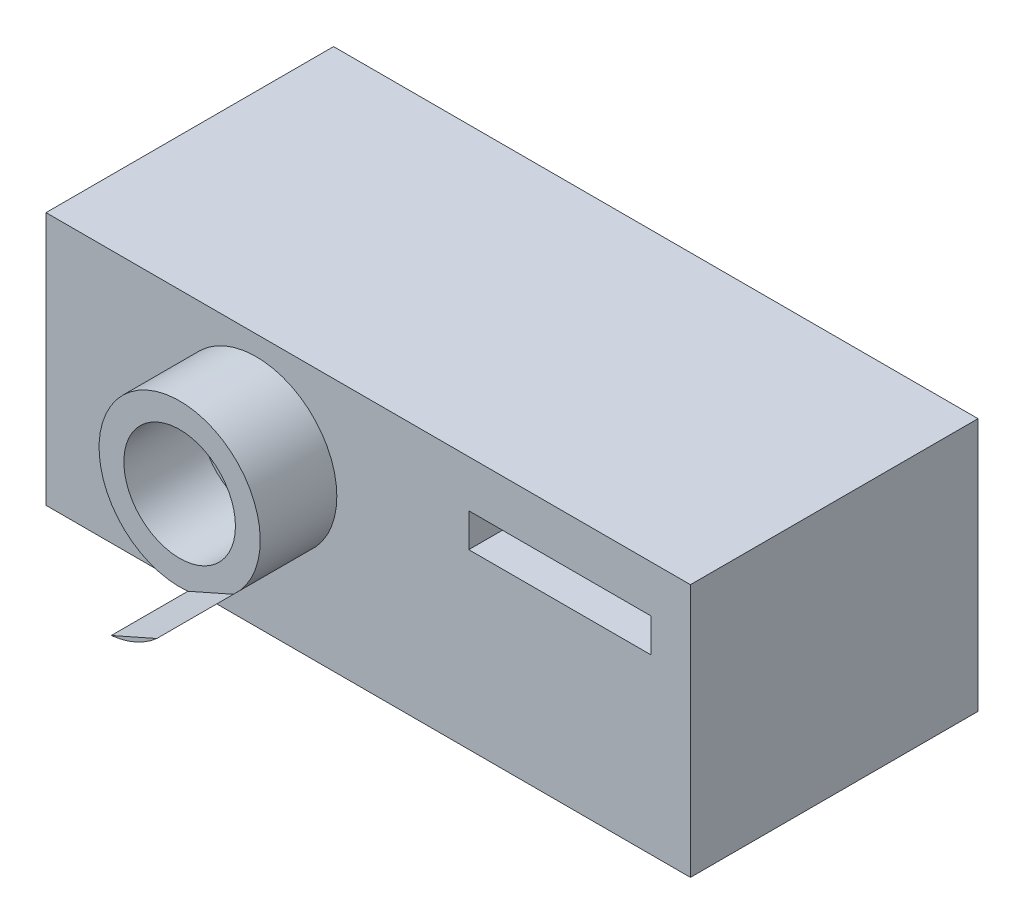
ISO-10303-21;
HEADER;
FILE_DESCRIPTION(('STEP AP214'),'2;1');
FILE_NAME('part.step','',(''),(''),'','','');
FILE_SCHEMA(('AUTOMOTIVE_DESIGN { 1 0 10303 214 1 1 1 1 }'));
ENDSEC;
DATA;
#1=APPLICATION_CONTEXT('core data for automotive mechanical design processes');
#2=APPLICATION_PROTOCOL_DEFINITION('international standard','automotive_design',2000,#1);
#3=PRODUCT_CONTEXT('',#1,'mechanical');
#4=PRODUCT('Part','Part','',(#3));
#5=PRODUCT_RELATED_PRODUCT_CATEGORY('part','',(#4));
#6=PRODUCT_DEFINITION_FORMATION('','',#4);
#7=PRODUCT_DEFINITION_CONTEXT('part definition',#1,'design');
#8=PRODUCT_DEFINITION('design','',#6,#7);
#9=PRODUCT_DEFINITION_SHAPE('','',#8);
#10=(LENGTH_UNIT() NAMED_UNIT(*) SI_UNIT(.MILLI.,.METRE.));
#11=(NAMED_UNIT(*) PLANE_ANGLE_UNIT() SI_UNIT($,.RADIAN.));
#12=(NAMED_UNIT(*) SI_UNIT($,.STERADIAN.) SOLID_ANGLE_UNIT());
#13=UNCERTAINTY_MEASURE_WITH_UNIT(LENGTH_MEASURE(1.E-05),#10,'distance_accuracy_value','');
#14=(GEOMETRIC_REPRESENTATION_CONTEXT(3) GLOBAL_UNCERTAINTY_ASSIGNED_CONTEXT((#13)) GLOBAL_UNIT_ASSIGNED_CONTEXT((#10,
#11,#12)) REPRESENTATION_CONTEXT('',''));
#15=CARTESIAN_POINT('',(0.,0.,0.));
#16=DIRECTION('',(0.,0.,1.));
#17=DIRECTION('',(1.,0.,0.));
#18=AXIS2_PLACEMENT_3D('',#15,#16,#17);
#19=CARTESIAN_POINT('',(-43.2566473819894,0.601942054077203,72.6690788812328));
#20=DIRECTION('',(0.,0.,1.));
#21=DIRECTION('',(1.,0.,0.));
#22=AXIS2_PLACEMENT_3D('',#19,#20,#21);
#23=PLANE('',#22);
#24=CARTESIAN_POINT('',(-43.2566473819894,0.601942054077203,72.6690788812328));
#25=DIRECTION('',(0.,0.,1.));
#26=DIRECTION('',(1.,0.,0.));
#27=AXIS2_PLACEMENT_3D('',#24,#25,#26);
#28=CIRCLE('',#27,13.4695419870651);
#29=CARTESIAN_POINT('',(-41.8807614743845,-12.7971437099055,72.6690788812328));
#30=VERTEX_POINT('',#29);
#31=CARTESIAN_POINT('',(-34.2722904315261,-9.4334897516784,72.6690788812328));
#32=VERTEX_POINT('',#31);
#33=EDGE_CURVE('E177',#30,#32,#28,.T.);
#34=ORIENTED_EDGE('',*,*,#33,.T.);
#35=DIRECTION('',(-0.914607866752376,-0.404341996427118,0.));
#36=VECTOR('',#35,1.);
#37=CARTESIAN_POINT('',(-38.0765259529553,-11.115316730792,72.6690788812328));
#38=LINE('',#37,#36);
#39=EDGE_CURVE('E173',#32,#30,#38,.T.);
#40=ORIENTED_EDGE('',*,*,#39,.T.);
#41=EDGE_LOOP('',(#34,#40));
#42=FACE_BOUND('',#41,.T.);
#43=ADVANCED_FACE('F55',(#42),#23,.T.);
#44=CARTESIAN_POINT('',(-43.2566473819894,0.601942054077203,72.6690788812328));
#45=DIRECTION('',(0.,0.,-1.));
#46=DIRECTION('',(-1.,0.,0.));
#47=AXIS2_PLACEMENT_3D('',#44,#45,#46);
#48=CYLINDRICAL_SURFACE('',#47,13.4695419870651);
#49=CARTESIAN_POINT('',(-43.2566473819894,0.601942054077203,47.0645021550188));
#50=DIRECTION('',(0.,0.,1.));
#51=DIRECTION('',(1.,0.,0.));
#52=AXIS2_PLACEMENT_3D('',#49,#50,#51);
#53=CIRCLE('',#52,13.4695419870651);
#54=CARTESIAN_POINT('',(-29.7871053949243,0.601942054077203,47.0645021550188));
#55=VERTEX_POINT('',#54);
#56=EDGE_CURVE('E176',#55,#55,#53,.T.);
#57=ORIENTED_EDGE('',*,*,#56,.T.);
#58=EDGE_LOOP('',(#57));
#59=FACE_BOUND('',#58,.T.);
#60=DIRECTION('',(0.,0.,-1.));
#61=VECTOR('',#60,1.);
#62=CARTESIAN_POINT('',(-34.2722904315261,-9.4334897516784,72.6690788812328));
#63=LINE('',#62,#61);
#64=CARTESIAN_POINT('',(-34.2722904315261,-9.4334897516784,59.8667905181258));
#65=VERTEX_POINT('',#64);
#66=EDGE_CURVE('E13',#32,#65,#63,.T.);
#67=ORIENTED_EDGE('',*,*,#66,.F.);
#68=ORIENTED_EDGE('',*,*,#33,.F.);
#69=DIRECTION('',(0.,0.,-1.));
#70=VECTOR('',#69,1.);
#71=CARTESIAN_POINT('',(-41.8807614743845,-12.7971437099055,72.6690788812328));
#72=LINE('',#71,#70);
#73=CARTESIAN_POINT('',(-41.8807614743845,-12.7971437099055,59.8667905181258));
#74=VERTEX_POINT('',#73);
#75=EDGE_CURVE('E63',#74,#30,#72,.F.);
#76=ORIENTED_EDGE('',*,*,#75,.F.);
#77=CARTESIAN_POINT('',(-43.2566473819894,0.601942054077203,59.8667905181258));
#78=DIRECTION('',(0.,0.,1.));
#79=DIRECTION('',(1.,0.,0.));
#80=AXIS2_PLACEMENT_3D('',#77,#78,#79);
#81=CIRCLE('',#80,13.4695419870651);
#82=EDGE_CURVE('E171',#65,#74,#81,.T.);
#83=ORIENTED_EDGE('',*,*,#82,.F.);
#84=EDGE_LOOP('',(#67,#68,#76,#83));
#85=FACE_BOUND('',#84,.T.);
#86=ADVANCED_FACE('F225',(#59,#85),#48,.T.);
#87=CARTESIAN_POINT('',(0.,0.,47.0645021550188));
#88=DIRECTION('',(0.,0.,1.));
#89=DIRECTION('',(1.,0.,0.));
#90=AXIS2_PLACEMENT_3D('',#87,#88,#89);
#91=PLANE('',#90);
#92=DIRECTION('',(0.,-1.,0.));
#93=VECTOR('',#92,1.);
#94=CARTESIAN_POINT('',(-7.73257116674131,3.89403962223867,47.0645021550188));
#95=LINE('',#94,#93);
#96=CARTESIAN_POINT('',(-7.73257116674131,9.5273575375785,47.0645021550188));
#97=VERTEX_POINT('',#96);
#98=CARTESIAN_POINT('',(-7.73257116674131,3.89403962223867,47.0645021550188));
#99=VERTEX_POINT('',#98);
#100=EDGE_CURVE('E70',#97,#99,#95,.T.);
#101=ORIENTED_EDGE('',*,*,#100,.F.);
#102=DIRECTION('',(-1.,0.,0.));
#103=VECTOR('',#102,1.);
#104=CARTESIAN_POINT('',(-7.73257116674131,9.5273575375785,47.0645021550188));
#105=LINE('',#104,#103);
#106=CARTESIAN_POINT('',(22.6942266019137,9.5273575375785,47.0645021550188));
#107=VERTEX_POINT('',#106);
#108=EDGE_CURVE('E151',#107,#97,#105,.T.);
#109=ORIENTED_EDGE('',*,*,#108,.F.);
#110=DIRECTION('',(0.,1.,0.));
#111=VECTOR('',#110,1.);
#112=CARTESIAN_POINT('',(22.6942266019137,3.89403962223867,47.0645021550188));
#113=LINE('',#112,#111);
#114=CARTESIAN_POINT('',(22.6942266019137,3.89403962223867,47.0645021550188));
#115=VERTEX_POINT('',#114);
#116=EDGE_CURVE('E154',#115,#107,#113,.T.);
#117=ORIENTED_EDGE('',*,*,#116,.F.);
#118=DIRECTION('',(1.,0.,0.));
#119=VECTOR('',#118,1.);
#120=CARTESIAN_POINT('',(-7.73257116674131,3.89403962223867,47.0645021550188));
#121=LINE('',#120,#119);
#122=EDGE_CURVE('E160',#99,#115,#121,.T.);
#123=ORIENTED_EDGE('',*,*,#122,.F.);
#124=EDGE_LOOP('',(#101,#109,#117,#123));
#125=FACE_BOUND('',#124,.T.);
#126=DIRECTION('',(0.,-1.,0.));
#127=VECTOR('',#126,1.);
#128=CARTESIAN_POINT('',(-78.3975170386473,17.3523688663283,47.0645021550188));
#129=LINE('',#128,#127);
#130=CARTESIAN_POINT('',(-78.3975170386473,17.3523688663283,47.0645021550188));
#131=VERTEX_POINT('',#130);
#132=CARTESIAN_POINT('',(-78.3975170386473,-25.0239424703892,47.0645021550188));
#133=VERTEX_POINT('',#132);
#134=EDGE_CURVE('E180',#131,#133,#129,.T.);
#135=ORIENTED_EDGE('',*,*,#134,.T.);
#136=DIRECTION('',(1.,0.,0.));
#137=VECTOR('',#136,1.);
#138=CARTESIAN_POINT('',(-78.3975170386473,-25.0239424703892,47.0645021550188));
#139=LINE('',#138,#137);
#140=CARTESIAN_POINT('',(29.3156280043262,-25.0239424703892,47.0645021550188));
#141=VERTEX_POINT('',#140);
#142=EDGE_CURVE('E185',#133,#141,#139,.T.);
#143=ORIENTED_EDGE('',*,*,#142,.T.);
#144=DIRECTION('',(0.,1.,0.));
#145=VECTOR('',#144,1.);
#146=CARTESIAN_POINT('',(29.3156280043262,17.3523688663283,47.0645021550188));
#147=LINE('',#146,#145);
#148=CARTESIAN_POINT('',(29.3156280043262,17.3523688663283,47.0645021550188));
#149=VERTEX_POINT('',#148);
#150=EDGE_CURVE('E188',#141,#149,#147,.T.);
#151=ORIENTED_EDGE('',*,*,#150,.T.);
#152=DIRECTION('',(-1.,0.,0.));
#153=VECTOR('',#152,1.);
#154=CARTESIAN_POINT('',(-78.3975170386473,17.3523688663283,47.0645021550188));
#155=LINE('',#154,#153);
#156=EDGE_CURVE('E191',#149,#131,#155,.T.);
#157=ORIENTED_EDGE('',*,*,#156,.T.);
#158=EDGE_LOOP('',(#135,#143,#151,#157));
#159=FACE_BOUND('',#158,.T.);
#160=ORIENTED_EDGE('',*,*,#56,.F.);
#161=EDGE_LOOP('',(#160));
#162=FACE_BOUND('',#161,.T.);
#163=ADVANCED_FACE('F239',(#125,#159,#162),#91,.T.);
#164=CARTESIAN_POINT('',(-78.3975170386473,17.3523688663283,-1.));
#165=DIRECTION('',(-1.,0.,0.));
#166=DIRECTION('',(0.,0.,1.));
#167=AXIS2_PLACEMENT_3D('',#164,#165,#166);
#168=PLANE('',#167);
#169=DIRECTION('',(0.,0.,1.));
#170=VECTOR('',#169,1.);
#171=CARTESIAN_POINT('',(-78.3975170386473,-25.0239424703892,-1.));
#172=LINE('',#171,#170);
#173=CARTESIAN_POINT('',(-78.3975170386473,-25.0239424703892,-1.));
#174=VERTEX_POINT('',#173);
#175=EDGE_CURVE('E206',#174,#133,#172,.T.);
#176=ORIENTED_EDGE('',*,*,#175,.T.);
#177=ORIENTED_EDGE('',*,*,#134,.F.);
#178=DIRECTION('',(0.,0.,1.));
#179=VECTOR('',#178,1.);
#180=CARTESIAN_POINT('',(-78.3975170386473,17.3523688663283,-1.));
#181=LINE('',#180,#179);
#182=CARTESIAN_POINT('',(-78.3975170386473,17.3523688663283,-1.));
#183=VERTEX_POINT('',#182);
#184=EDGE_CURVE('E207',#183,#131,#181,.T.);
#185=ORIENTED_EDGE('',*,*,#184,.F.);
#186=DIRECTION('',(0.,-1.,0.));
#187=VECTOR('',#186,1.);
#188=CARTESIAN_POINT('',(-78.3975170386473,17.3523688663283,-1.));
#189=LINE('',#188,#187);
#190=EDGE_CURVE('E194',#183,#174,#189,.T.);
#191=ORIENTED_EDGE('',*,*,#190,.T.);
#192=EDGE_LOOP('',(#176,#177,#185,#191));
#193=FACE_BOUND('',#192,.T.);
#194=ADVANCED_FACE('F57',(#193),#168,.T.);
#195=CARTESIAN_POINT('',(-78.3975170386473,17.3523688663283,-1.));
#196=DIRECTION('',(0.,1.,0.));
#197=DIRECTION('',(0.,0.,1.));
#198=AXIS2_PLACEMENT_3D('',#195,#196,#197);
#199=PLANE('',#198);
#200=ORIENTED_EDGE('',*,*,#184,.T.);
#201=ORIENTED_EDGE('',*,*,#156,.F.);
#202=DIRECTION('',(0.,0.,1.));
#203=VECTOR('',#202,1.);
#204=CARTESIAN_POINT('',(29.3156280043262,17.3523688663283,-1.));
#205=LINE('',#204,#203);
#206=CARTESIAN_POINT('',(29.3156280043262,17.3523688663283,-1.));
#207=VERTEX_POINT('',#206);
#208=EDGE_CURVE('E210',#207,#149,#205,.T.);
#209=ORIENTED_EDGE('',*,*,#208,.F.);
#210=DIRECTION('',(-1.,0.,0.));
#211=VECTOR('',#210,1.);
#212=CARTESIAN_POINT('',(-78.3975170386473,17.3523688663283,-1.));
#213=LINE('',#212,#211);
#214=EDGE_CURVE('E203',#207,#183,#213,.T.);
#215=ORIENTED_EDGE('',*,*,#214,.T.);
#216=EDGE_LOOP('',(#200,#201,#209,#215));
#217=FACE_BOUND('',#216,.T.);
#218=ADVANCED_FACE('F256',(#217),#199,.T.);
#219=CARTESIAN_POINT('',(29.3156280043262,17.3523688663283,-1.));
#220=DIRECTION('',(1.,0.,0.));
#221=DIRECTION('',(0.,0.,-1.));
#222=AXIS2_PLACEMENT_3D('',#219,#220,#221);
#223=PLANE('',#222);
#224=ORIENTED_EDGE('',*,*,#208,.T.);
#225=ORIENTED_EDGE('',*,*,#150,.F.);
#226=DIRECTION('',(0.,0.,1.));
#227=VECTOR('',#226,1.);
#228=CARTESIAN_POINT('',(29.3156280043262,-25.0239424703892,-1.));
#229=LINE('',#228,#227);
#230=CARTESIAN_POINT('',(29.3156280043262,-25.0239424703892,-1.));
#231=VERTEX_POINT('',#230);
#232=EDGE_CURVE('E212',#231,#141,#229,.T.);
#233=ORIENTED_EDGE('',*,*,#232,.F.);
#234=DIRECTION('',(0.,1.,0.));
#235=VECTOR('',#234,1.);
#236=CARTESIAN_POINT('',(29.3156280043262,17.3523688663283,-1.));
#237=LINE('',#236,#235);
#238=EDGE_CURVE('E200',#231,#207,#237,.T.);
#239=ORIENTED_EDGE('',*,*,#238,.T.);
#240=EDGE_LOOP('',(#224,#225,#233,#239));
#241=FACE_BOUND('',#240,.T.);
#242=ADVANCED_FACE('F259',(#241),#223,.T.);
#243=CARTESIAN_POINT('',(-78.3975170386473,-25.0239424703892,-1.));
#244=DIRECTION('',(0.,-1.,0.));
#245=DIRECTION('',(0.,0.,-1.));
#246=AXIS2_PLACEMENT_3D('',#243,#244,#245);
#247=PLANE('',#246);
#248=ORIENTED_EDGE('',*,*,#232,.T.);
#249=ORIENTED_EDGE('',*,*,#142,.F.);
#250=ORIENTED_EDGE('',*,*,#175,.F.);
#251=DIRECTION('',(1.,0.,0.));
#252=VECTOR('',#251,1.);
#253=CARTESIAN_POINT('',(-78.3975170386473,-25.0239424703892,-1.));
#254=LINE('',#253,#252);
#255=EDGE_CURVE('E197',#174,#231,#254,.T.);
#256=ORIENTED_EDGE('',*,*,#255,.T.);
#257=EDGE_LOOP('',(#248,#249,#250,#256));
#258=FACE_BOUND('',#257,.T.);
#259=ADVANCED_FACE('F254',(#258),#247,.T.);
#260=CARTESIAN_POINT('',(0.,0.,-1.));
#261=DIRECTION('',(0.,0.,1.));
#262=DIRECTION('',(1.,0.,0.));
#263=AXIS2_PLACEMENT_3D('',#260,#261,#262);
#264=PLANE('',#263);
#265=ORIENTED_EDGE('',*,*,#190,.F.);
#266=ORIENTED_EDGE('',*,*,#214,.F.);
#267=ORIENTED_EDGE('',*,*,#238,.F.);
#268=ORIENTED_EDGE('',*,*,#255,.F.);
#269=EDGE_LOOP('',(#265,#266,#267,#268));
#270=FACE_BOUND('',#269,.T.);
#271=ADVANCED_FACE('F240',(#270),#264,.F.);
#272=CARTESIAN_POINT('',(-15.3383675423375,-1.06292958101637,59.8667905181258));
#273=DIRECTION('',(-0.404341996427118,0.914607866752376,0.));
#274=DIRECTION('',(-0.914607866752376,-0.404341996427118,0.));
#275=AXIS2_PLACEMENT_3D('',#272,#273,#274);
#276=PLANE('',#275);
#277=ORIENTED_EDGE('',*,*,#66,.T.);
#278=DIRECTION('',(-0.914607866752376,-0.404341996427118,0.));
#279=VECTOR('',#278,1.);
#280=CARTESIAN_POINT('',(-15.3383675423375,-1.06292958101637,59.8667905181258));
#281=LINE('',#280,#279);
#282=EDGE_CURVE('E77',#65,#74,#281,.T.);
#283=ORIENTED_EDGE('',*,*,#282,.T.);
#284=ORIENTED_EDGE('',*,*,#75,.T.);
#285=ORIENTED_EDGE('',*,*,#39,.F.);
#286=EDGE_LOOP('',(#277,#283,#284,#285));
#287=FACE_BOUND('',#286,.T.);
#288=ADVANCED_FACE('F219',(#287),#276,.T.);
#289=CARTESIAN_POINT('',(-24.5409445171605,-6.493207909042,59.8667905181258));
#290=DIRECTION('',(0.,0.,1.));
#291=DIRECTION('',(1.,0.,0.));
#292=AXIS2_PLACEMENT_3D('',#289,#290,#291);
#293=PLANE('',#292);
#294=CARTESIAN_POINT('',(-43.2566473819894,0.601942054077203,59.8667905181258));
#295=DIRECTION('',(0.,0.,1.));
#296=DIRECTION('',(1.,0.,0.));
#297=AXIS2_PLACEMENT_3D('',#294,#295,#296);
#298=CIRCLE('',#297,9.32585795243942);
#299=CARTESIAN_POINT('',(-33.93078942955,0.601942054077203,59.8667905181258));
#300=VERTEX_POINT('',#299);
#301=EDGE_CURVE('E170',#300,#300,#298,.T.);
#302=ORIENTED_EDGE('',*,*,#301,.F.);
#303=EDGE_LOOP('',(#302));
#304=FACE_BOUND('',#303,.T.);
#305=ORIENTED_EDGE('',*,*,#82,.T.);
#306=ORIENTED_EDGE('',*,*,#282,.F.);
#307=EDGE_LOOP('',(#305,#306));
#308=FACE_BOUND('',#307,.T.);
#309=ADVANCED_FACE('F227',(#304,#308),#293,.T.);
#310=CARTESIAN_POINT('',(-43.2566473819894,0.601942054077203,47.0645021550188));
#311=DIRECTION('',(0.,0.,1.));
#312=DIRECTION('',(1.,0.,0.));
#313=AXIS2_PLACEMENT_3D('',#310,#311,#312);
#314=CIRCLE('',#313,9.32585795243942);
#315=CARTESIAN_POINT('',(-33.93078942955,0.601942054077203,47.0645021550188));
#316=VERTEX_POINT('',#315);
#317=EDGE_CURVE('E209',#316,#316,#314,.F.);
#318=ORIENTED_EDGE('',*,*,#317,.F.);
#319=EDGE_LOOP('',(#318));
#320=FACE_BOUND('',#319,.T.);
#321=ADVANCED_FACE('F229',(#320),#91,.T.);
#322=CARTESIAN_POINT('',(-43.2566473819894,0.601942054077203,72.6690788812328));
#323=DIRECTION('',(0.,0.,-1.));
#324=DIRECTION('',(-1.,0.,0.));
#325=AXIS2_PLACEMENT_3D('',#322,#323,#324);
#326=CYLINDRICAL_SURFACE('',#325,9.32585795243942);
#327=ORIENTED_EDGE('',*,*,#317,.T.);
#328=EDGE_LOOP('',(#327));
#329=FACE_BOUND('',#328,.T.);
#330=ORIENTED_EDGE('',*,*,#301,.T.);
#331=EDGE_LOOP('',(#330));
#332=FACE_BOUND('',#331,.T.);
#333=ADVANCED_FACE('F236',(#329,#332),#326,.F.);
#334=CARTESIAN_POINT('',(-7.73257116674131,3.89403962223867,27.4599254288047));
#335=DIRECTION('',(-1.,0.,0.));
#336=DIRECTION('',(0.,0.,1.));
#337=AXIS2_PLACEMENT_3D('',#334,#335,#336);
#338=PLANE('',#337);
#339=ORIENTED_EDGE('',*,*,#100,.T.);
#340=DIRECTION('',(0.,0.,1.));
#341=VECTOR('',#340,1.);
#342=CARTESIAN_POINT('',(-7.73257116674131,3.89403962223867,27.4599254288047));
#343=LINE('',#342,#341);
#344=CARTESIAN_POINT('',(-7.73257116674131,3.89403962223867,27.4599254288047));
#345=VERTEX_POINT('',#344);
#346=EDGE_CURVE('E129',#345,#99,#343,.T.);
#347=ORIENTED_EDGE('',*,*,#346,.F.);
#348=DIRECTION('',(0.,-1.,0.));
#349=VECTOR('',#348,1.);
#350=CARTESIAN_POINT('',(-7.73257116674131,3.89403962223867,27.4599254288047));
#351=LINE('',#350,#349);
#352=CARTESIAN_POINT('',(-7.73257116674131,9.5273575375785,27.4599254288047));
#353=VERTEX_POINT('',#352);
#354=EDGE_CURVE('E133',#353,#345,#351,.T.);
#355=ORIENTED_EDGE('',*,*,#354,.F.);
#356=DIRECTION('',(0.,0.,1.));
#357=VECTOR('',#356,1.);
#358=CARTESIAN_POINT('',(-7.73257116674131,9.5273575375785,27.4599254288047));
#359=LINE('',#358,#357);
#360=EDGE_CURVE('E164',#353,#97,#359,.T.);
#361=ORIENTED_EDGE('',*,*,#360,.T.);
#362=EDGE_LOOP('',(#339,#347,#355,#361));
#363=FACE_BOUND('',#362,.T.);
#364=ADVANCED_FACE('F131',(#363),#338,.F.);
#365=CARTESIAN_POINT('',(-7.73257116674131,9.5273575375785,27.4599254288047));
#366=DIRECTION('',(0.,1.,0.));
#367=DIRECTION('',(0.,0.,1.));
#368=AXIS2_PLACEMENT_3D('',#365,#366,#367);
#369=PLANE('',#368);
#370=ORIENTED_EDGE('',*,*,#108,.T.);
#371=ORIENTED_EDGE('',*,*,#360,.F.);
#372=DIRECTION('',(-1.,0.,0.));
#373=VECTOR('',#372,1.);
#374=CARTESIAN_POINT('',(-7.73257116674131,9.5273575375785,27.4599254288047));
#375=LINE('',#374,#373);
#376=CARTESIAN_POINT('',(22.6942266019137,9.5273575375785,27.4599254288047));
#377=VERTEX_POINT('',#376);
#378=EDGE_CURVE('E139',#377,#353,#375,.T.);
#379=ORIENTED_EDGE('',*,*,#378,.F.);
#380=DIRECTION('',(0.,0.,1.));
#381=VECTOR('',#380,1.);
#382=CARTESIAN_POINT('',(22.6942266019137,9.5273575375785,27.4599254288047));
#383=LINE('',#382,#381);
#384=EDGE_CURVE('E166',#377,#107,#383,.T.);
#385=ORIENTED_EDGE('',*,*,#384,.T.);
#386=EDGE_LOOP('',(#370,#371,#379,#385));
#387=FACE_BOUND('',#386,.T.);
#388=ADVANCED_FACE('F290',(#387),#369,.F.);
#389=CARTESIAN_POINT('',(22.6942266019137,3.89403962223867,27.4599254288047));
#390=DIRECTION('',(1.,0.,0.));
#391=DIRECTION('',(0.,0.,-1.));
#392=AXIS2_PLACEMENT_3D('',#389,#390,#391);
#393=PLANE('',#392);
#394=ORIENTED_EDGE('',*,*,#116,.T.);
#395=ORIENTED_EDGE('',*,*,#384,.F.);
#396=DIRECTION('',(0.,1.,0.));
#397=VECTOR('',#396,1.);
#398=CARTESIAN_POINT('',(22.6942266019137,3.89403962223867,27.4599254288047));
#399=LINE('',#398,#397);
#400=CARTESIAN_POINT('',(22.6942266019137,3.89403962223867,27.4599254288047));
#401=VERTEX_POINT('',#400);
#402=EDGE_CURVE('E147',#401,#377,#399,.T.);
#403=ORIENTED_EDGE('',*,*,#402,.F.);
#404=DIRECTION('',(0.,0.,1.));
#405=VECTOR('',#404,1.);
#406=CARTESIAN_POINT('',(22.6942266019137,3.89403962223867,27.4599254288047));
#407=LINE('',#406,#405);
#408=EDGE_CURVE('E138',#401,#115,#407,.T.);
#409=ORIENTED_EDGE('',*,*,#408,.T.);
#410=EDGE_LOOP('',(#394,#395,#403,#409));
#411=FACE_BOUND('',#410,.T.);
#412=ADVANCED_FACE('F288',(#411),#393,.F.);
#413=CARTESIAN_POINT('',(-7.73257116674131,3.89403962223867,27.4599254288047));
#414=DIRECTION('',(0.,-1.,0.));
#415=DIRECTION('',(0.,0.,-1.));
#416=AXIS2_PLACEMENT_3D('',#413,#414,#415);
#417=PLANE('',#416);
#418=ORIENTED_EDGE('',*,*,#122,.T.);
#419=ORIENTED_EDGE('',*,*,#408,.F.);
#420=DIRECTION('',(1.,0.,0.));
#421=VECTOR('',#420,1.);
#422=CARTESIAN_POINT('',(-7.73257116674131,3.89403962223867,27.4599254288047));
#423=LINE('',#422,#421);
#424=EDGE_CURVE('E142',#345,#401,#423,.T.);
#425=ORIENTED_EDGE('',*,*,#424,.F.);
#426=ORIENTED_EDGE('',*,*,#346,.T.);
#427=EDGE_LOOP('',(#418,#419,#425,#426));
#428=FACE_BOUND('',#427,.T.);
#429=ADVANCED_FACE('F143',(#428),#417,.F.);
#430=CARTESIAN_POINT('',(0.,0.,27.4599254288047));
#431=DIRECTION('',(0.,0.,-1.));
#432=DIRECTION('',(-1.,0.,0.));
#433=AXIS2_PLACEMENT_3D('',#430,#431,#432);
#434=PLANE('',#433);
#435=ORIENTED_EDGE('',*,*,#354,.T.);
#436=ORIENTED_EDGE('',*,*,#424,.T.);
#437=ORIENTED_EDGE('',*,*,#402,.T.);
#438=ORIENTED_EDGE('',*,*,#378,.T.);
#439=EDGE_LOOP('',(#435,#436,#437,#438));
#440=FACE_BOUND('',#439,.T.);
#441=ADVANCED_FACE('F149',(#440),#434,.F.);
#442=CLOSED_SHELL('',(#43,#86,#163,#194,#218,#242,#259,#271,#288,#309,#321,#333,#364,#388,#412,
#429,#441));
#443=MANIFOLD_SOLID_BREP('B2',#442);
#444=ADVANCED_BREP_SHAPE_REPRESENTATION('',(#18,#443),#14);
#445=SHAPE_DEFINITION_REPRESENTATION(#9,#444);
ENDSEC;
END-ISO-10303-21;
